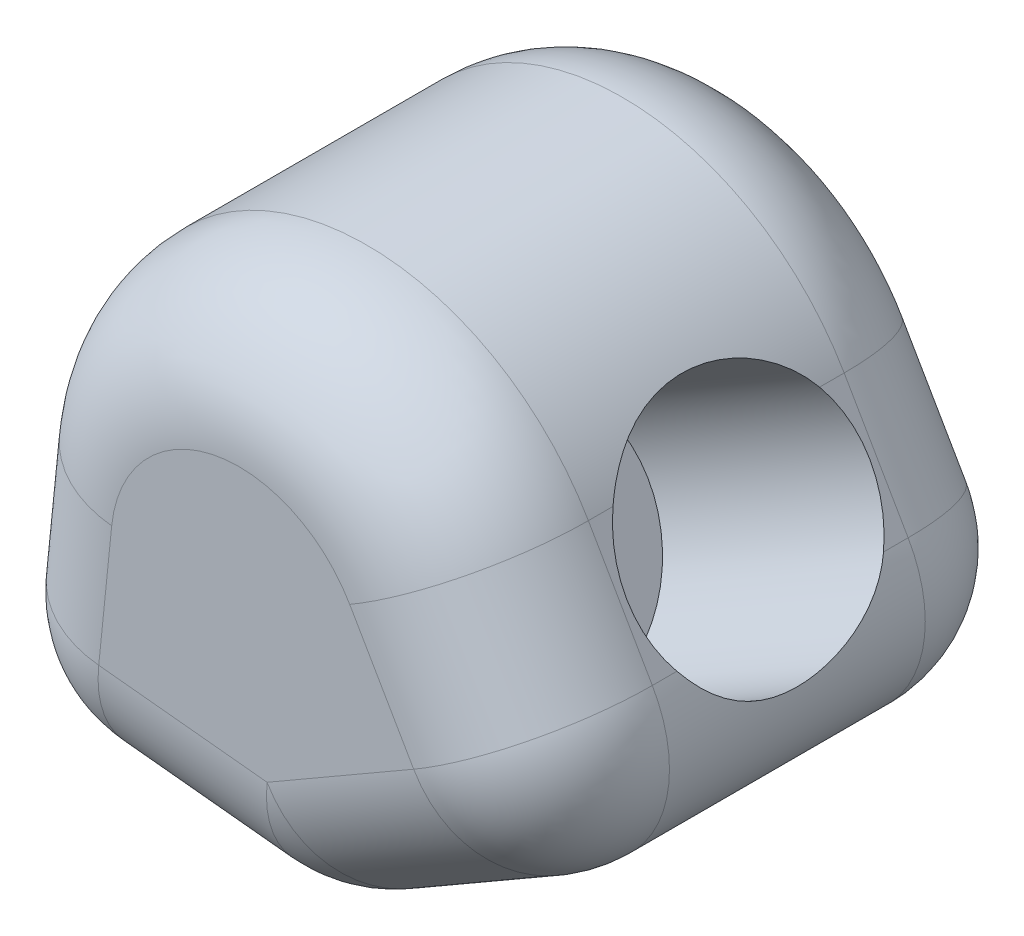
ISO-10303-21;
HEADER;
FILE_DESCRIPTION(('STEP AP214'),'2;1');
FILE_NAME('part.step','',(''),(''),'','','');
FILE_SCHEMA(('AUTOMOTIVE_DESIGN { 1 0 10303 214 1 1 1 1 }'));
ENDSEC;
DATA;
#1=APPLICATION_CONTEXT('core data for automotive mechanical design processes');
#2=APPLICATION_PROTOCOL_DEFINITION('international standard','automotive_design',2000,#1);
#3=PRODUCT_CONTEXT('',#1,'mechanical');
#4=PRODUCT('Part','Part','',(#3));
#5=PRODUCT_RELATED_PRODUCT_CATEGORY('part','',(#4));
#6=PRODUCT_DEFINITION_FORMATION('','',#4);
#7=PRODUCT_DEFINITION_CONTEXT('part definition',#1,'design');
#8=PRODUCT_DEFINITION('design','',#6,#7);
#9=PRODUCT_DEFINITION_SHAPE('','',#8);
#10=(LENGTH_UNIT() NAMED_UNIT(*) SI_UNIT(.MILLI.,.METRE.));
#11=(NAMED_UNIT(*) PLANE_ANGLE_UNIT() SI_UNIT($,.RADIAN.));
#12=(NAMED_UNIT(*) SI_UNIT($,.STERADIAN.) SOLID_ANGLE_UNIT());
#13=UNCERTAINTY_MEASURE_WITH_UNIT(LENGTH_MEASURE(1.E-05),#10,'distance_accuracy_value','');
#14=(GEOMETRIC_REPRESENTATION_CONTEXT(3) GLOBAL_UNCERTAINTY_ASSIGNED_CONTEXT((#13)) GLOBAL_UNIT_ASSIGNED_CONTEXT((#10,
#11,#12)) REPRESENTATION_CONTEXT('',''));
#15=CARTESIAN_POINT('',(0.,0.,0.));
#16=DIRECTION('',(0.,0.,1.));
#17=DIRECTION('',(1.,0.,0.));
#18=AXIS2_PLACEMENT_3D('',#15,#16,#17);
#19=CARTESIAN_POINT('',(147.13325853426,-45.7921285376472,0.));
#20=DIRECTION('',(-0.99484975116711,0.101360606759925,0.));
#21=DIRECTION('',(-0.101360606759925,-0.99484975116711,0.));
#22=AXIS2_PLACEMENT_3D('',#19,#20,#21);
#23=PLANE('',#22);
#24=CARTESIAN_POINT('',(147.18393883764,-45.2947036620637,0.));
#25=DIRECTION('',(-0.99484975116711,0.101360606759925,0.));
#26=DIRECTION('',(-0.101360606759925,-0.99484975116711,0.));
#27=AXIS2_PLACEMENT_3D('',#24,#25,#26);
#28=CIRCLE('',#27,0.950000000000001);
#29=CARTESIAN_POINT('',(147.13325853426,-45.7921285376472,0.807774721070219));
#30=VERTEX_POINT('',#29);
#31=CARTESIAN_POINT('',(147.23461914102,-44.7972787864801,0.807774721070197));
#32=VERTEX_POINT('',#31);
#33=EDGE_CURVE('E54',#30,#32,#28,.T.);
#34=ORIENTED_EDGE('',*,*,#33,.F.);
#35=DIRECTION('',(0.,0.,1.));
#36=VECTOR('',#35,1.);
#37=CARTESIAN_POINT('',(147.13325853426,-45.7921285376472,2.));
#38=LINE('',#37,#36);
#39=CARTESIAN_POINT('',(147.13325853426,-45.7921285376472,1.));
#40=VERTEX_POINT('',#39);
#41=EDGE_CURVE('E393',#30,#40,#38,.T.);
#42=ORIENTED_EDGE('',*,*,#41,.T.);
#43=DIRECTION('',(0.101360606759925,0.99484975116711,0.));
#44=VECTOR('',#43,1.);
#45=CARTESIAN_POINT('',(147.23461914102,-44.7972787864802,1.));
#46=LINE('',#45,#44);
#47=CARTESIAN_POINT('',(147.23461914102,-44.7972787864801,1.));
#48=VERTEX_POINT('',#47);
#49=EDGE_CURVE('E395',#40,#48,#46,.T.);
#50=ORIENTED_EDGE('',*,*,#49,.T.);
#51=DIRECTION('',(0.,0.,1.));
#52=VECTOR('',#51,1.);
#53=CARTESIAN_POINT('',(147.23461914102,-44.7972787864801,-2.));
#54=LINE('',#53,#52);
#55=EDGE_CURVE('E274',#32,#48,#54,.T.);
#56=ORIENTED_EDGE('',*,*,#55,.F.);
#57=EDGE_LOOP('',(#34,#42,#50,#56));
#58=FACE_BOUND('',#57,.T.);
#59=ADVANCED_FACE('F39',(#58),#23,.T.);
#60=CARTESIAN_POINT('',(149.474318643355,-45.4330127018922,0.));
#61=DIRECTION('',(0.866025403784432,0.500000000000011,0.));
#62=DIRECTION('',(-0.500000000000011,0.866025403784432,0.));
#63=AXIS2_PLACEMENT_3D('',#60,#61,#62);
#64=PLANE('',#63);
#65=CARTESIAN_POINT('',(149.474318643355,-45.4330127018922,0.));
#66=DIRECTION('',(0.866025403784432,0.500000000000011,0.));
#67=DIRECTION('',(-0.500000000000011,0.866025403784432,0.));
#68=AXIS2_PLACEMENT_3D('',#65,#66,#67);
#69=CIRCLE('',#68,0.950000000000004);
#70=CARTESIAN_POINT('',(149.224318643355,-45.,0.807774721070159));
#71=VERTEX_POINT('',#70);
#72=CARTESIAN_POINT('',(149.224318643355,-45.,-0.807774721070174));
#73=VERTEX_POINT('',#72);
#74=EDGE_CURVE('E172',#71,#73,#69,.T.);
#75=ORIENTED_EDGE('',*,*,#74,.T.);
#76=DIRECTION('',(0.,0.,1.));
#77=VECTOR('',#76,1.);
#78=CARTESIAN_POINT('',(149.224318643355,-45.,0.));
#79=LINE('',#78,#77);
#80=EDGE_CURVE('E11',#73,#71,#79,.T.);
#81=ORIENTED_EDGE('',*,*,#80,.T.);
#82=EDGE_LOOP('',(#75,#81));
#83=FACE_BOUND('',#82,.T.);
#84=ADVANCED_FACE('F175',(#83),#64,.T.);
#85=CARTESIAN_POINT('',(151.456369450923,-44.8660254037844,1.));
#86=DIRECTION('',(0.866025403784432,0.500000000000011,0.));
#87=DIRECTION('',(-0.500000000000011,0.866025403784433,0.));
#88=AXIS2_PLACEMENT_3D('',#85,#86,#87);
#89=PLANE('',#88);
#90=CARTESIAN_POINT('',(151.206369450923,-44.4330127018922,0.));
#91=DIRECTION('',(0.866025403784432,0.500000000000011,0.));
#92=DIRECTION('',(-0.500000000000011,0.866025403784432,0.));
#93=AXIS2_PLACEMENT_3D('',#90,#91,#92);
#94=CIRCLE('',#93,0.950000000000004);
#95=CARTESIAN_POINT('',(150.956369450923,-43.9999999999999,0.807774721070154));
#96=VERTEX_POINT('',#95);
#97=CARTESIAN_POINT('',(151.456369450923,-44.8660254037844,0.807774721070195));
#98=VERTEX_POINT('',#97);
#99=EDGE_CURVE('E177',#96,#98,#94,.T.);
#100=ORIENTED_EDGE('',*,*,#99,.F.);
#101=DIRECTION('',(0.,0.,1.));
#102=VECTOR('',#101,1.);
#103=CARTESIAN_POINT('',(150.956369450923,-44.,-2.));
#104=LINE('',#103,#102);
#105=CARTESIAN_POINT('',(150.956369450923,-44.,1.));
#106=VERTEX_POINT('',#105);
#107=EDGE_CURVE('E273',#96,#106,#104,.T.);
#108=ORIENTED_EDGE('',*,*,#107,.T.);
#109=DIRECTION('',(-0.500000000000011,0.866025403784433,0.));
#110=VECTOR('',#109,1.);
#111=CARTESIAN_POINT('',(94.1647182049331,54.3660254037849,1.));
#112=LINE('',#111,#110);
#113=CARTESIAN_POINT('',(151.456369450923,-44.8660254037844,1.));
#114=VERTEX_POINT('',#113);
#115=EDGE_CURVE('E389',#106,#114,#112,.F.);
#116=ORIENTED_EDGE('',*,*,#115,.T.);
#117=DIRECTION('',(0.,0.,1.));
#118=VECTOR('',#117,1.);
#119=CARTESIAN_POINT('',(151.456369450923,-44.8660254037844,-2.));
#120=LINE('',#119,#118);
#121=EDGE_CURVE('E386',#114,#98,#120,.F.);
#122=ORIENTED_EDGE('',*,*,#121,.T.);
#123=EDGE_LOOP('',(#100,#108,#116,#122));
#124=FACE_BOUND('',#123,.T.);
#125=ADVANCED_FACE('F251',(#124),#89,.T.);
#126=CARTESIAN_POINT('',(147.23461914102,-44.7972787864802,-0.807774721070197));
#127=VERTEX_POINT('',#126);
#128=CARTESIAN_POINT('',(147.13325853426,-45.7921285376472,-0.807774721070219));
#129=VERTEX_POINT('',#128);
#130=EDGE_CURVE('E263',#127,#129,#28,.T.);
#131=ORIENTED_EDGE('',*,*,#130,.F.);
#132=CARTESIAN_POINT('',(147.23461914102,-44.7972787864801,-1.));
#133=VERTEX_POINT('',#132);
#134=EDGE_CURVE('E221',#133,#127,#54,.T.);
#135=ORIENTED_EDGE('',*,*,#134,.F.);
#136=DIRECTION('',(0.101360606759925,0.99484975116711,0.));
#137=VECTOR('',#136,1.);
#138=CARTESIAN_POINT('',(150.239228428213,-15.3071751133892,-1.));
#139=LINE('',#138,#137);
#140=CARTESIAN_POINT('',(147.13325853426,-45.7921285376472,-1.));
#141=VERTEX_POINT('',#140);
#142=EDGE_CURVE('E391',#133,#141,#139,.F.);
#143=ORIENTED_EDGE('',*,*,#142,.T.);
#144=EDGE_CURVE('E267',#141,#129,#38,.T.);
#145=ORIENTED_EDGE('',*,*,#144,.T.);
#146=EDGE_LOOP('',(#131,#135,#143,#145));
#147=FACE_BOUND('',#146,.T.);
#148=ADVANCED_FACE('F41',(#147),#23,.T.);
#149=CARTESIAN_POINT('',(151.456369450923,-44.8660254037844,-0.807774721070195));
#150=VERTEX_POINT('',#149);
#151=CARTESIAN_POINT('',(150.956369450923,-44.,-0.807774721070154));
#152=VERTEX_POINT('',#151);
#153=EDGE_CURVE('E181',#150,#152,#94,.T.);
#154=ORIENTED_EDGE('',*,*,#153,.F.);
#155=CARTESIAN_POINT('',(151.456369450923,-44.8660254037844,-1.));
#156=VERTEX_POINT('',#155);
#157=EDGE_CURVE('E385',#150,#156,#120,.F.);
#158=ORIENTED_EDGE('',*,*,#157,.T.);
#159=DIRECTION('',(-0.500000000000011,0.866025403784433,0.));
#160=VECTOR('',#159,1.);
#161=CARTESIAN_POINT('',(150.956369450923,-44.0000000000001,-1.));
#162=LINE('',#161,#160);
#163=CARTESIAN_POINT('',(150.956369450923,-44.,-1.));
#164=VERTEX_POINT('',#163);
#165=EDGE_CURVE('E383',#156,#164,#162,.T.);
#166=ORIENTED_EDGE('',*,*,#165,.T.);
#167=EDGE_CURVE('E275',#164,#152,#104,.T.);
#168=ORIENTED_EDGE('',*,*,#167,.T.);
#169=EDGE_LOOP('',(#154,#158,#166,#168));
#170=FACE_BOUND('',#169,.T.);
#171=ADVANCED_FACE('F210',(#170),#89,.T.);
#172=CARTESIAN_POINT('',(149.44445378466,-46.0276054552886,1.));
#173=DIRECTION('',(0.,0.,1.));
#174=DIRECTION('',(1.,0.,0.));
#175=AXIS2_PLACEMENT_3D('',#172,#173,#174);
#176=SPHERICAL_SURFACE('',#175,1.);
#177=CARTESIAN_POINT('',(149.44445378466,-46.0276054552886,1.));
#178=DIRECTION('',(0.,0.,1.));
#179=DIRECTION('',(1.,0.,0.));
#180=AXIS2_PLACEMENT_3D('',#177,#178,#179);
#181=CIRCLE('',#180,1.);
#182=CARTESIAN_POINT('',(149.94445378466,-46.893630859073,1.));
#183=VERTEX_POINT('',#182);
#184=CARTESIAN_POINT('',(149.3430931779,-47.0224552064557,1.));
#185=VERTEX_POINT('',#184);
#186=EDGE_CURVE('E307',#183,#185,#181,.F.);
#187=ORIENTED_EDGE('',*,*,#186,.F.);
#188=CARTESIAN_POINT('',(149.44445378466,-46.0276054552886,1.));
#189=DIRECTION('',(-0.86602540378444,-0.499999999999999,0.));
#190=DIRECTION('',(0.499999999999999,-0.866025403784439,0.));
#191=AXIS2_PLACEMENT_3D('',#188,#189,#190);
#192=CIRCLE('',#191,1.);
#193=CARTESIAN_POINT('',(149.44445378466,-46.0276054552886,2.));
#194=VERTEX_POINT('',#193);
#195=EDGE_CURVE('E199',#194,#183,#192,.F.);
#196=ORIENTED_EDGE('',*,*,#195,.F.);
#197=CARTESIAN_POINT('',(149.44445378466,-46.0276054552886,1.));
#198=DIRECTION('',(0.994849751167113,-0.101360606759888,0.));
#199=DIRECTION('',(0.101360606759888,0.994849751167113,0.));
#200=AXIS2_PLACEMENT_3D('',#197,#198,#199);
#201=CIRCLE('',#200,1.);
#202=EDGE_CURVE('E302',#185,#194,#201,.F.);
#203=ORIENTED_EDGE('',*,*,#202,.F.);
#204=EDGE_LOOP('',(#187,#196,#203));
#205=FACE_BOUND('',#204,.T.);
#206=ADVANCED_FACE('F258',(#205),#176,.T.);
#207=CARTESIAN_POINT('',(149.44445378466,-46.0276054552886,-1.));
#208=DIRECTION('',(0.,0.,1.));
#209=DIRECTION('',(1.,0.,0.));
#210=AXIS2_PLACEMENT_3D('',#207,#208,#209);
#211=SPHERICAL_SURFACE('',#210,1.);
#212=CARTESIAN_POINT('',(149.44445378466,-46.0276054552886,-1.));
#213=DIRECTION('',(0.99484975116711,-0.101360606759915,0.));
#214=DIRECTION('',(0.101360606759915,0.994849751167111,0.));
#215=AXIS2_PLACEMENT_3D('',#212,#213,#214);
#216=CIRCLE('',#215,1.);
#217=CARTESIAN_POINT('',(149.44445378466,-46.0276054552886,-2.));
#218=VERTEX_POINT('',#217);
#219=CARTESIAN_POINT('',(149.3430931779,-47.0224552064557,-1.));
#220=VERTEX_POINT('',#219);
#221=EDGE_CURVE('E333',#218,#220,#216,.F.);
#222=ORIENTED_EDGE('',*,*,#221,.F.);
#223=CARTESIAN_POINT('',(149.44445378466,-46.0276054552886,-1.));
#224=DIRECTION('',(-0.866025403784451,-0.499999999999978,0.));
#225=DIRECTION('',(0.499999999999978,-0.866025403784452,0.));
#226=AXIS2_PLACEMENT_3D('',#223,#224,#225);
#227=CIRCLE('',#226,1.);
#228=CARTESIAN_POINT('',(149.94445378466,-46.893630859073,-1.));
#229=VERTEX_POINT('',#228);
#230=EDGE_CURVE('E324',#229,#218,#227,.F.);
#231=ORIENTED_EDGE('',*,*,#230,.F.);
#232=CARTESIAN_POINT('',(149.44445378466,-46.0276054552886,-1.));
#233=DIRECTION('',(0.,0.,-1.));
#234=DIRECTION('',(-1.,0.,0.));
#235=AXIS2_PLACEMENT_3D('',#232,#233,#234);
#236=CIRCLE('',#235,1.);
#237=EDGE_CURVE('E321',#229,#220,#236,.T.);
#238=ORIENTED_EDGE('',*,*,#237,.T.);
#239=EDGE_LOOP('',(#222,#231,#238));
#240=FACE_BOUND('',#239,.T.);
#241=ADVANCED_FACE('F453',(#240),#211,.T.);
#242=CARTESIAN_POINT('',(149.44445378466,-46.0276054552886,-2.));
#243=DIRECTION('',(0.,0.,-1.));
#244=DIRECTION('',(-1.,0.,0.));
#245=AXIS2_PLACEMENT_3D('',#242,#243,#244);
#246=CYLINDRICAL_SURFACE('',#245,1.);
#247=ORIENTED_EDGE('',*,*,#186,.T.);
#248=DIRECTION('',(0.,0.,1.));
#249=VECTOR('',#248,1.);
#250=CARTESIAN_POINT('',(149.3430931779,-47.0224552064557,2.));
#251=LINE('',#250,#249);
#252=EDGE_CURVE('E370',#220,#185,#251,.T.);
#253=ORIENTED_EDGE('',*,*,#252,.F.);
#254=ORIENTED_EDGE('',*,*,#237,.F.);
#255=DIRECTION('',(0.,0.,1.));
#256=VECTOR('',#255,1.);
#257=CARTESIAN_POINT('',(149.94445378466,-46.893630859073,-2.));
#258=LINE('',#257,#256);
#259=EDGE_CURVE('E379',#183,#229,#258,.F.);
#260=ORIENTED_EDGE('',*,*,#259,.F.);
#261=EDGE_LOOP('',(#247,#253,#254,#260));
#262=FACE_BOUND('',#261,.T.);
#263=ADVANCED_FACE('F451',(#262),#246,.T.);
#264=CARTESIAN_POINT('',(-3.10596989395215,-30.4849534242581,1.));
#265=DIRECTION('',(0.99484975116711,-0.101360606759924,0.));
#266=DIRECTION('',(0.101360606759924,0.99484975116711,0.));
#267=AXIS2_PLACEMENT_3D('',#264,#265,#266);
#268=CYLINDRICAL_SURFACE('',#267,1.);
#269=ORIENTED_EDGE('',*,*,#202,.T.);
#270=DIRECTION('',(0.99484975116711,-0.101360606759924,0.));
#271=VECTOR('',#270,1.);
#272=CARTESIAN_POINT('',(-3.10596989395215,-30.4849534242581,2.));
#273=LINE('',#272,#271);
#274=CARTESIAN_POINT('',(148.128108285428,-45.8934891444071,2.));
#275=VERTEX_POINT('',#274);
#276=EDGE_CURVE('E357',#275,#194,#273,.T.);
#277=ORIENTED_EDGE('',*,*,#276,.F.);
#278=CARTESIAN_POINT('',(148.128108285428,-45.8934891444071,1.));
#279=DIRECTION('',(-0.99484975116711,0.101360606759915,0.));
#280=DIRECTION('',(-0.101360606759915,-0.994849751167111,0.));
#281=AXIS2_PLACEMENT_3D('',#278,#279,#280);
#282=CIRCLE('',#281,1.);
#283=CARTESIAN_POINT('',(148.026747678668,-46.8883388955742,1.));
#284=VERTEX_POINT('',#283);
#285=EDGE_CURVE('E318',#284,#275,#282,.T.);
#286=ORIENTED_EDGE('',*,*,#285,.F.);
#287=DIRECTION('',(0.99484975116711,-0.101360606759924,0.));
#288=VECTOR('',#287,1.);
#289=CARTESIAN_POINT('',(-3.20733050071208,-31.4798031754252,1.));
#290=LINE('',#289,#288);
#291=EDGE_CURVE('E372',#185,#284,#290,.F.);
#292=ORIENTED_EDGE('',*,*,#291,.F.);
#293=EDGE_LOOP('',(#269,#277,#286,#292));
#294=FACE_BOUND('',#293,.T.);
#295=ADVANCED_FACE('F460',(#294),#268,.T.);
#296=CARTESIAN_POINT('',(57.2916512459867,-99.2320508075684,1.));
#297=DIRECTION('',(0.866025403784444,0.49999999999999,0.));
#298=DIRECTION('',(-0.49999999999999,0.866025403784445,0.));
#299=AXIS2_PLACEMENT_3D('',#296,#297,#298);
#300=CYLINDRICAL_SURFACE('',#299,1.);
#301=ORIENTED_EDGE('',*,*,#195,.T.);
#302=DIRECTION('',(-0.866025403784444,-0.49999999999999,0.));
#303=VECTOR('',#302,1.);
#304=CARTESIAN_POINT('',(149.664588925965,-47.0552109105772,1.));
#305=LINE('',#304,#303);
#306=CARTESIAN_POINT('',(151.090344047139,-46.2320508075688,1.));
#307=VERTEX_POINT('',#306);
#308=EDGE_CURVE('E381',#307,#183,#305,.T.);
#309=ORIENTED_EDGE('',*,*,#308,.F.);
#310=CARTESIAN_POINT('',(150.590344047139,-45.3660254037844,1.));
#311=DIRECTION('',(0.866025403784422,0.500000000000028,0.));
#312=DIRECTION('',(-0.500000000000028,0.866025403784422,0.));
#313=AXIS2_PLACEMENT_3D('',#310,#311,#312);
#314=CIRCLE('',#313,1.);
#315=CARTESIAN_POINT('',(150.590344047139,-45.3660254037844,2.));
#316=VERTEX_POINT('',#315);
#317=EDGE_CURVE('E310',#316,#307,#314,.T.);
#318=ORIENTED_EDGE('',*,*,#317,.F.);
#319=DIRECTION('',(-0.866025403784444,-0.49999999999999,0.));
#320=VECTOR('',#319,1.);
#321=CARTESIAN_POINT('',(151.456369450923,-44.8660254037844,2.));
#322=LINE('',#321,#320);
#323=EDGE_CURVE('E179',#194,#316,#322,.F.);
#324=ORIENTED_EDGE('',*,*,#323,.F.);
#325=EDGE_LOOP('',(#301,#309,#318,#324));
#326=FACE_BOUND('',#325,.T.);
#327=ADVANCED_FACE('F467',(#326),#300,.T.);
#328=CARTESIAN_POINT('',(57.2916512459867,-99.2320508075684,-1.));
#329=DIRECTION('',(-0.866025403784444,-0.49999999999999,0.));
#330=DIRECTION('',(0.49999999999999,-0.866025403784445,0.));
#331=AXIS2_PLACEMENT_3D('',#328,#329,#330);
#332=CYLINDRICAL_SURFACE('',#331,1.);
#333=ORIENTED_EDGE('',*,*,#230,.T.);
#334=DIRECTION('',(-0.866025403784444,-0.49999999999999,0.));
#335=VECTOR('',#334,1.);
#336=CARTESIAN_POINT('',(57.2916512459867,-99.2320508075685,-2.));
#337=LINE('',#336,#335);
#338=CARTESIAN_POINT('',(150.590344047139,-45.3660254037844,-2.));
#339=VERTEX_POINT('',#338);
#340=EDGE_CURVE('E404',#339,#218,#337,.T.);
#341=ORIENTED_EDGE('',*,*,#340,.F.);
#342=CARTESIAN_POINT('',(150.590344047139,-45.3660254037844,-1.));
#343=DIRECTION('',(0.86602540378444,0.499999999999999,0.));
#344=DIRECTION('',(-0.499999999999999,0.866025403784439,0.));
#345=AXIS2_PLACEMENT_3D('',#342,#343,#344);
#346=CIRCLE('',#345,1.);
#347=CARTESIAN_POINT('',(151.090344047139,-46.2320508075688,-1.));
#348=VERTEX_POINT('',#347);
#349=EDGE_CURVE('E335',#348,#339,#346,.T.);
#350=ORIENTED_EDGE('',*,*,#349,.F.);
#351=DIRECTION('',(-0.866025403784444,-0.49999999999999,0.));
#352=VECTOR('',#351,1.);
#353=CARTESIAN_POINT('',(57.7916512459867,-100.098076211353,-1.));
#354=LINE('',#353,#352);
#355=EDGE_CURVE('E374',#229,#348,#354,.F.);
#356=ORIENTED_EDGE('',*,*,#355,.F.);
#357=EDGE_LOOP('',(#333,#341,#350,#356));
#358=FACE_BOUND('',#357,.T.);
#359=ADVANCED_FACE('F429',(#358),#332,.T.);
#360=CARTESIAN_POINT('',(-3.10596989395215,-30.4849534242581,-1.));
#361=DIRECTION('',(-0.99484975116711,0.101360606759924,0.));
#362=DIRECTION('',(-0.101360606759924,-0.99484975116711,0.));
#363=AXIS2_PLACEMENT_3D('',#360,#361,#362);
#364=CYLINDRICAL_SURFACE('',#363,1.);
#365=ORIENTED_EDGE('',*,*,#221,.T.);
#366=DIRECTION('',(0.99484975116711,-0.101360606759924,0.));
#367=VECTOR('',#366,1.);
#368=CARTESIAN_POINT('',(149.664588925965,-47.0552109105772,-1.));
#369=LINE('',#368,#367);
#370=CARTESIAN_POINT('',(148.026747678668,-46.8883388955742,-1.));
#371=VERTEX_POINT('',#370);
#372=EDGE_CURVE('E365',#371,#220,#369,.T.);
#373=ORIENTED_EDGE('',*,*,#372,.F.);
#374=CARTESIAN_POINT('',(148.128108285428,-45.8934891444071,-1.));
#375=DIRECTION('',(-0.994849751167108,0.101360606759943,0.));
#376=DIRECTION('',(-0.101360606759943,-0.994849751167108,0.));
#377=AXIS2_PLACEMENT_3D('',#374,#375,#376);
#378=CIRCLE('',#377,1.);
#379=CARTESIAN_POINT('',(148.128108285428,-45.8934891444071,-2.));
#380=VERTEX_POINT('',#379);
#381=EDGE_CURVE('E343',#380,#371,#378,.T.);
#382=ORIENTED_EDGE('',*,*,#381,.F.);
#383=DIRECTION('',(0.99484975116711,-0.101360606759924,0.));
#384=VECTOR('',#383,1.);
#385=CARTESIAN_POINT('',(147.13325853426,-45.7921285376472,-2.));
#386=LINE('',#385,#384);
#387=EDGE_CURVE('E283',#218,#380,#386,.F.);
#388=ORIENTED_EDGE('',*,*,#387,.F.);
#389=EDGE_LOOP('',(#365,#373,#382,#388));
#390=FACE_BOUND('',#389,.T.);
#391=ADVANCED_FACE('F415',(#390),#364,.T.);
#392=CARTESIAN_POINT('',(0.,0.,2.));
#393=DIRECTION('',(0.,0.,1.));
#394=DIRECTION('',(1.,0.,0.));
#395=AXIS2_PLACEMENT_3D('',#392,#393,#394);
#396=PLANE('',#395);
#397=ORIENTED_EDGE('',*,*,#276,.T.);
#398=ORIENTED_EDGE('',*,*,#323,.T.);
#399=DIRECTION('',(-0.500000000000011,0.866025403784433,0.));
#400=VECTOR('',#399,1.);
#401=CARTESIAN_POINT('',(93.2986928011486,53.8660254037849,2.));
#402=LINE('',#401,#400);
#403=CARTESIAN_POINT('',(150.090344047139,-44.5,2.));
#404=VERTEX_POINT('',#403);
#405=EDGE_CURVE('E363',#316,#404,#402,.T.);
#406=ORIENTED_EDGE('',*,*,#405,.T.);
#407=CARTESIAN_POINT('',(149.224318643355,-45.,2.));
#408=DIRECTION('',(0.,0.,1.));
#409=DIRECTION('',(1.,0.,0.));
#410=AXIS2_PLACEMENT_3D('',#407,#408,#409);
#411=CIRCLE('',#410,0.999999999999994);
#412=CARTESIAN_POINT('',(148.229468892187,-44.8986393932401,2.));
#413=VERTEX_POINT('',#412);
#414=EDGE_CURVE('E361',#404,#413,#411,.T.);
#415=ORIENTED_EDGE('',*,*,#414,.T.);
#416=DIRECTION('',(0.101360606759925,0.99484975116711,0.));
#417=VECTOR('',#416,1.);
#418=CARTESIAN_POINT('',(148.026747678668,-46.8883388955742,2.));
#419=LINE('',#418,#417);
#420=EDGE_CURVE('E359',#413,#275,#419,.F.);
#421=ORIENTED_EDGE('',*,*,#420,.T.);
#422=EDGE_LOOP('',(#397,#398,#406,#415,#421));
#423=FACE_BOUND('',#422,.T.);
#424=ADVANCED_FACE('F472',(#423),#396,.T.);
#425=CARTESIAN_POINT('',(148.128108285428,-45.8934891444071,1.));
#426=DIRECTION('',(0.,0.,1.));
#427=DIRECTION('',(1.,0.,0.));
#428=AXIS2_PLACEMENT_3D('',#425,#426,#427);
#429=SPHERICAL_SURFACE('',#428,1.);
#430=ORIENTED_EDGE('',*,*,#285,.T.);
#431=CARTESIAN_POINT('',(148.128108285428,-45.8934891444071,1.));
#432=DIRECTION('',(-0.101360606759928,-0.994849751167109,0.));
#433=DIRECTION('',(0.994849751167109,-0.101360606759928,0.));
#434=AXIS2_PLACEMENT_3D('',#431,#432,#433);
#435=CIRCLE('',#434,1.);
#436=EDGE_CURVE('E315',#275,#40,#435,.T.);
#437=ORIENTED_EDGE('',*,*,#436,.T.);
#438=CARTESIAN_POINT('',(148.128108285428,-45.8934891444071,1.));
#439=DIRECTION('',(0.,0.,1.));
#440=DIRECTION('',(1.,0.,0.));
#441=AXIS2_PLACEMENT_3D('',#438,#439,#440);
#442=CIRCLE('',#441,1.);
#443=EDGE_CURVE('E330',#284,#40,#442,.F.);
#444=ORIENTED_EDGE('',*,*,#443,.F.);
#445=EDGE_LOOP('',(#430,#437,#444));
#446=FACE_BOUND('',#445,.T.);
#447=ADVANCED_FACE('F464',(#446),#429,.T.);
#448=CARTESIAN_POINT('',(-3.20733050071208,-31.4798031754252,-2.));
#449=DIRECTION('',(-0.101360606759924,-0.994849751167109,0.));
#450=DIRECTION('',(0.99484975116711,-0.101360606759924,0.));
#451=AXIS2_PLACEMENT_3D('',#448,#449,#450);
#452=PLANE('',#451);
#453=DIRECTION('',(0.,0.,1.));
#454=VECTOR('',#453,1.);
#455=CARTESIAN_POINT('',(148.026747678668,-46.8883388955742,-2.));
#456=LINE('',#455,#454);
#457=EDGE_CURVE('E368',#284,#371,#456,.F.);
#458=ORIENTED_EDGE('',*,*,#457,.T.);
#459=ORIENTED_EDGE('',*,*,#372,.T.);
#460=ORIENTED_EDGE('',*,*,#252,.T.);
#461=ORIENTED_EDGE('',*,*,#291,.T.);
#462=EDGE_LOOP('',(#458,#459,#460,#461));
#463=FACE_BOUND('',#462,.T.);
#464=ADVANCED_FACE('F231',(#463),#452,.T.);
#465=CARTESIAN_POINT('',(0.,0.,-2.));
#466=DIRECTION('',(0.,0.,1.));
#467=DIRECTION('',(1.,0.,0.));
#468=AXIS2_PLACEMENT_3D('',#465,#466,#467);
#469=PLANE('',#468);
#470=DIRECTION('',(0.101360606759925,0.99484975116711,0.));
#471=VECTOR('',#470,1.);
#472=CARTESIAN_POINT('',(151.23407817938,-15.4085357201491,-2.));
#473=LINE('',#472,#471);
#474=CARTESIAN_POINT('',(148.229468892187,-44.8986393932401,-2.));
#475=VERTEX_POINT('',#474);
#476=EDGE_CURVE('E400',#380,#475,#473,.T.);
#477=ORIENTED_EDGE('',*,*,#476,.T.);
#478=CARTESIAN_POINT('',(149.224318643355,-45.,-2.));
#479=DIRECTION('',(0.,0.,1.));
#480=DIRECTION('',(1.,0.,0.));
#481=AXIS2_PLACEMENT_3D('',#478,#479,#480);
#482=CIRCLE('',#481,0.999999999999994);
#483=CARTESIAN_POINT('',(150.090344047139,-44.5,-2.));
#484=VERTEX_POINT('',#483);
#485=EDGE_CURVE('E397',#475,#484,#482,.F.);
#486=ORIENTED_EDGE('',*,*,#485,.T.);
#487=DIRECTION('',(-0.500000000000011,0.866025403784433,0.));
#488=VECTOR('',#487,1.);
#489=CARTESIAN_POINT('',(151.090344047139,-46.2320508075689,-2.));
#490=LINE('',#489,#488);
#491=EDGE_CURVE('E402',#484,#339,#490,.F.);
#492=ORIENTED_EDGE('',*,*,#491,.T.);
#493=ORIENTED_EDGE('',*,*,#340,.T.);
#494=ORIENTED_EDGE('',*,*,#387,.T.);
#495=EDGE_LOOP('',(#477,#486,#492,#493,#494));
#496=FACE_BOUND('',#495,.T.);
#497=ADVANCED_FACE('F408',(#496),#469,.F.);
#498=CARTESIAN_POINT('',(149.224318643355,-45.,-1.));
#499=DIRECTION('',(0.,0.,1.));
#500=DIRECTION('',(1.,0.,0.));
#501=AXIS2_PLACEMENT_3D('',#498,#499,#500);
#502=DEGENERATE_TOROIDAL_SURFACE('',#501,0.999999999999994,1.,.T.);
#503=CARTESIAN_POINT('',(150.090344047139,-44.5,-1.));
#504=DIRECTION('',(-0.500000000000004,0.866025403784437,0.));
#505=DIRECTION('',(-0.866025403784436,-0.500000000000004,0.));
#506=AXIS2_PLACEMENT_3D('',#503,#504,#505);
#507=CIRCLE('',#506,1.);
#508=EDGE_CURVE('E352',#164,#484,#507,.T.);
#509=ORIENTED_EDGE('',*,*,#508,.T.);
#510=ORIENTED_EDGE('',*,*,#485,.F.);
#511=CARTESIAN_POINT('',(148.229468892187,-44.8986393932401,-1.));
#512=DIRECTION('',(0.101360606759925,0.99484975116711,0.));
#513=DIRECTION('',(-0.99484975116711,0.101360606759925,0.));
#514=AXIS2_PLACEMENT_3D('',#511,#512,#513);
#515=CIRCLE('',#514,1.);
#516=EDGE_CURVE('E220',#475,#133,#515,.T.);
#517=ORIENTED_EDGE('',*,*,#516,.T.);
#518=CARTESIAN_POINT('',(149.224318643355,-45.,-1.));
#519=DIRECTION('',(0.,0.,1.));
#520=DIRECTION('',(1.,0.,0.));
#521=AXIS2_PLACEMENT_3D('',#518,#519,#520);
#522=CIRCLE('',#521,1.99999999999999);
#523=EDGE_CURVE('E272',#164,#133,#522,.T.);
#524=ORIENTED_EDGE('',*,*,#523,.F.);
#525=EDGE_LOOP('',(#509,#510,#517,#524));
#526=FACE_BOUND('',#525,.T.);
#527=ADVANCED_FACE('F229',(#526),#502,.T.);
#528=CARTESIAN_POINT('',(148.128108285428,-45.8934891444071,-1.));
#529=DIRECTION('',(0.,0.,1.));
#530=DIRECTION('',(1.,0.,0.));
#531=AXIS2_PLACEMENT_3D('',#528,#529,#530);
#532=SPHERICAL_SURFACE('',#531,1.);
#533=ORIENTED_EDGE('',*,*,#381,.T.);
#534=CARTESIAN_POINT('',(148.128108285428,-45.8934891444071,-1.));
#535=DIRECTION('',(0.,0.,-1.));
#536=DIRECTION('',(-1.,0.,0.));
#537=AXIS2_PLACEMENT_3D('',#534,#535,#536);
#538=CIRCLE('',#537,1.);
#539=EDGE_CURVE('E340',#371,#141,#538,.T.);
#540=ORIENTED_EDGE('',*,*,#539,.T.);
#541=CARTESIAN_POINT('',(148.128108285428,-45.8934891444071,-1.));
#542=DIRECTION('',(-0.101360606759921,-0.99484975116711,0.));
#543=DIRECTION('',(0.99484975116711,-0.101360606759921,0.));
#544=AXIS2_PLACEMENT_3D('',#541,#542,#543);
#545=CIRCLE('',#544,1.);
#546=EDGE_CURVE('E349',#380,#141,#545,.F.);
#547=ORIENTED_EDGE('',*,*,#546,.F.);
#548=EDGE_LOOP('',(#533,#540,#547));
#549=FACE_BOUND('',#548,.T.);
#550=ADVANCED_FACE('F418',(#549),#532,.T.);
#551=CARTESIAN_POINT('',(151.23407817938,-15.4085357201491,-1.));
#552=DIRECTION('',(0.101360606759925,0.99484975116711,0.));
#553=DIRECTION('',(-0.99484975116711,0.101360606759925,0.));
#554=AXIS2_PLACEMENT_3D('',#551,#552,#553);
#555=CYLINDRICAL_SURFACE('',#554,1.);
#556=ORIENTED_EDGE('',*,*,#546,.T.);
#557=ORIENTED_EDGE('',*,*,#142,.F.);
#558=ORIENTED_EDGE('',*,*,#516,.F.);
#559=ORIENTED_EDGE('',*,*,#476,.F.);
#560=EDGE_LOOP('',(#556,#557,#558,#559));
#561=FACE_BOUND('',#560,.T.);
#562=ADVANCED_FACE('F422',(#561),#555,.T.);
#563=CARTESIAN_POINT('',(150.590344047139,-45.3660254037844,-1.));
#564=DIRECTION('',(0.,0.,1.));
#565=DIRECTION('',(1.,0.,0.));
#566=AXIS2_PLACEMENT_3D('',#563,#564,#565);
#567=SPHERICAL_SURFACE('',#566,1.);
#568=CARTESIAN_POINT('',(150.590344047139,-45.3660254037844,-1.));
#569=DIRECTION('',(0.,0.,-1.));
#570=DIRECTION('',(-1.,0.,0.));
#571=AXIS2_PLACEMENT_3D('',#568,#569,#570);
#572=CIRCLE('',#571,1.);
#573=EDGE_CURVE('E338',#156,#348,#572,.T.);
#574=ORIENTED_EDGE('',*,*,#573,.T.);
#575=ORIENTED_EDGE('',*,*,#349,.T.);
#576=CARTESIAN_POINT('',(150.590344047139,-45.3660254037844,-1.));
#577=DIRECTION('',(0.500000000000021,-0.866025403784426,0.));
#578=DIRECTION('',(0.866025403784427,0.500000000000021,0.));
#579=AXIS2_PLACEMENT_3D('',#576,#577,#578);
#580=CIRCLE('',#579,1.);
#581=EDGE_CURVE('E346',#156,#339,#580,.F.);
#582=ORIENTED_EDGE('',*,*,#581,.F.);
#583=EDGE_LOOP('',(#574,#575,#582));
#584=FACE_BOUND('',#583,.T.);
#585=ADVANCED_FACE('F436',(#584),#567,.T.);
#586=CARTESIAN_POINT('',(93.2986928011486,53.8660254037849,-1.));
#587=DIRECTION('',(0.500000000000011,-0.866025403784433,0.));
#588=DIRECTION('',(0.866025403784432,0.500000000000011,0.));
#589=AXIS2_PLACEMENT_3D('',#586,#587,#588);
#590=CYLINDRICAL_SURFACE('',#589,1.);
#591=ORIENTED_EDGE('',*,*,#581,.T.);
#592=ORIENTED_EDGE('',*,*,#491,.F.);
#593=ORIENTED_EDGE('',*,*,#508,.F.);
#594=ORIENTED_EDGE('',*,*,#165,.F.);
#595=EDGE_LOOP('',(#591,#592,#593,#594));
#596=FACE_BOUND('',#595,.T.);
#597=ADVANCED_FACE('F439',(#596),#590,.T.);
#598=CARTESIAN_POINT('',(148.128108285428,-45.8934891444071,-2.));
#599=DIRECTION('',(0.,0.,-1.));
#600=DIRECTION('',(-1.,0.,0.));
#601=AXIS2_PLACEMENT_3D('',#598,#599,#600);
#602=CYLINDRICAL_SURFACE('',#601,1.);
#603=CARTESIAN_POINT('',(147.13325853426,-45.7921285376472,-0.807774721070217));
#604=CARTESIAN_POINT('',(147.128808286797,-45.8356683679362,-0.780728478925981));
#605=CARTESIAN_POINT('',(147.127483934738,-45.8771040972475,-0.750174645235957));
#606=CARTESIAN_POINT('',(147.12923179671,-45.9545566836069,-0.683242434496667));
#607=CARTESIAN_POINT('',(147.132283042756,-45.9905984762552,-0.646892572675732));
#608=CARTESIAN_POINT('',(147.14090382173,-46.0563666496611,-0.569423565132301));
#609=CARTESIAN_POINT('',(147.146464051692,-46.0861157695901,-0.528322451440242));
#610=CARTESIAN_POINT('',(147.158303414866,-46.1388652578622,-0.441999279103337));
#611=CARTESIAN_POINT('',(147.164583668767,-46.1618549015871,-0.396770819363252));
#612=CARTESIAN_POINT('',(147.176574875258,-46.2017997675019,-0.299529700347529));
#613=CARTESIAN_POINT('',(147.182206958969,-46.2181677954283,-0.247262650299686));
#614=CARTESIAN_POINT('',(147.190487946811,-46.2413773059551,-0.14046627191814));
#615=CARTESIAN_POINT('',(147.193141467247,-46.2482335342561,-0.0859405805177638));
#616=CARTESIAN_POINT('',(147.194522496841,-46.2518447407895,0.0189798108930409));
#617=CARTESIAN_POINT('',(147.193555679191,-46.2493859898068,0.0693444283581493));
#618=CARTESIAN_POINT('',(147.188661173876,-46.2362517698503,0.168843990087968));
#619=CARTESIAN_POINT('',(147.184732372532,-46.2255732102698,0.217978464648642));
#620=CARTESIAN_POINT('',(147.175162011363,-46.1969856022973,0.312239121906973));
#621=CARTESIAN_POINT('',(147.169576103992,-46.1793060427462,0.35744172434152));
#622=CARTESIAN_POINT('',(147.158044154733,-46.1373101048263,0.444655311826876));
#623=CARTESIAN_POINT('',(147.152097675053,-46.112985527528,0.486662271543371));
#624=CARTESIAN_POINT('',(147.140791336892,-46.0552469802789,0.571172693899379));
#625=CARTESIAN_POINT('',(147.135570292786,-46.0211229551947,0.613211695602867));
#626=CARTESIAN_POINT('',(147.128806463323,-45.9463386263305,0.691242959019938));
#627=CARTESIAN_POINT('',(147.12725164492,-45.9057001741674,0.727254640609795));
#628=CARTESIAN_POINT('',(147.128940775076,-45.8511189025003,0.768169373606517));
#629=CARTESIAN_POINT('',(147.129494866583,-45.8395444699301,0.776459217278774));
#630=CARTESIAN_POINT('',(147.131040287224,-45.8160729320834,0.792513471202036));
#631=CARTESIAN_POINT('',(147.132031420711,-45.8041759734237,0.800278114773276));
#632=CARTESIAN_POINT('',(147.13325853426,-45.7921285376472,0.807774721070231));
#633=B_SPLINE_CURVE_WITH_KNOTS('',3,(#603,#604,#605,#606,#607,#608,#609,#610,#611,#612,#613,
#614,#615,#616,#617,#618,#619,#620,#621,#622,#623,#624,#625,#626,#627,#628,#629,#630,#631,#632),
.UNSPECIFIED.,.F.,.F.,(4,2,2,2,2,2,2,2,2,2,2,2,2,2,4),(0.,0.1538074567111,0.306880322196099,
0.459390219878526,0.612140800698552,0.77643286659063,0.940469952444962,1.09098160687053,
1.24154988058079,1.38754444671328,1.53371996767869,1.69615413105594,1.85805441705973,
1.90078296757982,1.94349240953927),.UNSPECIFIED.);
#634=EDGE_CURVE('E184',#129,#30,#633,.T.);
#635=ORIENTED_EDGE('',*,*,#634,.F.);
#636=ORIENTED_EDGE('',*,*,#144,.F.);
#637=ORIENTED_EDGE('',*,*,#539,.F.);
#638=ORIENTED_EDGE('',*,*,#457,.F.);
#639=ORIENTED_EDGE('',*,*,#443,.T.);
#640=ORIENTED_EDGE('',*,*,#41,.F.);
#641=EDGE_LOOP('',(#635,#636,#637,#638,#639,#640));
#642=FACE_BOUND('',#641,.T.);
#643=ADVANCED_FACE('F493',(#642),#602,.T.);
#644=CARTESIAN_POINT('',(57.7916512459867,-100.098076211353,-2.));
#645=DIRECTION('',(-0.49999999999999,0.866025403784445,0.));
#646=DIRECTION('',(-0.866025403784444,-0.49999999999999,0.));
#647=AXIS2_PLACEMENT_3D('',#644,#645,#646);
#648=PLANE('',#647);
#649=ORIENTED_EDGE('',*,*,#259,.T.);
#650=ORIENTED_EDGE('',*,*,#355,.T.);
#651=DIRECTION('',(0.,0.,1.));
#652=VECTOR('',#651,1.);
#653=CARTESIAN_POINT('',(151.090344047139,-46.2320508075689,2.));
#654=LINE('',#653,#652);
#655=EDGE_CURVE('E377',#348,#307,#654,.T.);
#656=ORIENTED_EDGE('',*,*,#655,.T.);
#657=ORIENTED_EDGE('',*,*,#308,.T.);
#658=EDGE_LOOP('',(#649,#650,#656,#657));
#659=FACE_BOUND('',#658,.T.);
#660=ADVANCED_FACE('F446',(#659),#648,.F.);
#661=CARTESIAN_POINT('',(150.590344047139,-45.3660254037844,1.));
#662=DIRECTION('',(0.,0.,1.));
#663=DIRECTION('',(1.,0.,0.));
#664=AXIS2_PLACEMENT_3D('',#661,#662,#663);
#665=SPHERICAL_SURFACE('',#664,1.);
#666=CARTESIAN_POINT('',(150.590344047139,-45.3660254037844,1.));
#667=DIRECTION('',(0.500000000000004,-0.866025403784437,0.));
#668=DIRECTION('',(0.866025403784436,0.500000000000004,0.));
#669=AXIS2_PLACEMENT_3D('',#666,#667,#668);
#670=CIRCLE('',#669,1.);
#671=EDGE_CURVE('E313',#114,#316,#670,.T.);
#672=ORIENTED_EDGE('',*,*,#671,.T.);
#673=ORIENTED_EDGE('',*,*,#317,.T.);
#674=CARTESIAN_POINT('',(150.590344047139,-45.3660254037844,1.));
#675=DIRECTION('',(0.,0.,1.));
#676=DIRECTION('',(1.,0.,0.));
#677=AXIS2_PLACEMENT_3D('',#674,#675,#676);
#678=CIRCLE('',#677,1.);
#679=EDGE_CURVE('E327',#114,#307,#678,.F.);
#680=ORIENTED_EDGE('',*,*,#679,.F.);
#681=EDGE_LOOP('',(#672,#673,#680));
#682=FACE_BOUND('',#681,.T.);
#683=ADVANCED_FACE('F486',(#682),#665,.T.);
#684=CARTESIAN_POINT('',(150.590344047139,-45.3660254037844,-2.));
#685=DIRECTION('',(0.,0.,-1.));
#686=DIRECTION('',(-1.,0.,0.));
#687=AXIS2_PLACEMENT_3D('',#684,#685,#686);
#688=CYLINDRICAL_SURFACE('',#687,1.);
#689=CARTESIAN_POINT('',(151.456369450923,-44.8660254037844,0.807774721070217));
#690=CARTESIAN_POINT('',(151.478264999872,-44.9039213990917,0.780728478925978));
#691=CARTESIAN_POINT('',(151.496447032553,-44.9411784421776,0.750174645235955));
#692=CARTESIAN_POINT('',(151.526580541866,-45.0125502137105,0.683242434496667));
#693=CARTESIAN_POINT('',(151.538561361166,-45.0466791001358,0.646892572675732));
#694=CARTESIAN_POINT('',(151.557638633303,-45.1102072683063,0.569423565132298));
#695=CARTESIAN_POINT('',(151.564752887696,-45.1396234828521,0.528322451440237));
#696=CARTESIAN_POINT('',(151.575560994555,-45.1925938883581,0.44199927910333));
#697=CARTESIAN_POINT('',(151.579249431404,-45.2161387549169,0.396770819363245));
#698=CARTESIAN_POINT('',(151.584673682972,-45.2574904035053,0.29952970034752));
#699=CARTESIAN_POINT('',(151.586240904852,-45.2747292120693,0.247262650299677));
#700=CARTESIAN_POINT('',(151.588194248365,-45.2992942398048,0.140466271918134));
#701=CARTESIAN_POINT('',(151.588582199282,-45.3066358017169,0.0859405805177611));
#702=CARTESIAN_POINT('',(151.588801670447,-45.3104958389932,-0.018979810893043));
#703=CARTESIAN_POINT('',(151.588676432836,-45.3078568035054,-0.069344428358154));
#704=CARTESIAN_POINT('',(151.587761068493,-45.2938701661588,-0.168843990087976));
#705=CARTESIAN_POINT('',(151.586970691663,-45.2825192886959,-0.217978464648651));
#706=CARTESIAN_POINT('',(151.583990467683,-45.2525199319107,-0.312239121906982));
#707=CARTESIAN_POINT('',(151.581843860566,-45.2341036004367,-0.357441724341529));
#708=CARTESIAN_POINT('',(151.575160444301,-45.1910690026982,-0.444655311826885));
#709=CARTESIAN_POINT('',(151.570620675885,-45.1664430776587,-0.486662271543382));
#710=CARTESIAN_POINT('',(151.557282581224,-45.109139776254,-0.57117269389939));
#711=CARTESIAN_POINT('',(151.548066752361,-45.0758715197943,-0.613211695602874));
#712=CARTESIAN_POINT('',(151.523602072338,-45.0048790929866,-0.691242959019947));
#713=CARTESIAN_POINT('',(151.508373149653,-44.967169927412,-0.727254640609808));
#714=CARTESIAN_POINT('',(151.484473357057,-44.9180703521458,-0.768169373606528));
#715=CARTESIAN_POINT('',(151.479226492563,-44.9077386088416,-0.776459217278783));
#716=CARTESIAN_POINT('',(151.468201714592,-44.8869598772986,-0.792513471202039));
#717=CARTESIAN_POINT('',(151.462424039653,-44.8765129426647,-0.800278114773276));
#718=CARTESIAN_POINT('',(151.456369450923,-44.8660254037844,-0.807774721070228));
#719=B_SPLINE_CURVE_WITH_KNOTS('',3,(#689,#690,#691,#692,#693,#694,#695,#696,#697,#698,#699,
#700,#701,#702,#703,#704,#705,#706,#707,#708,#709,#710,#711,#712,#713,#714,#715,#716,#717,#718),
.UNSPECIFIED.,.F.,.F.,(4,2,2,2,2,2,2,2,2,2,2,2,2,2,4),(0.,0.15380745671109,0.306880322196098,
0.459390219878525,0.612140800698553,0.776432866590629,0.940469952444954,1.09098160687053,
1.24154988058079,1.38754444671329,1.53371996767869,1.69615413105593,1.85805441705974,
1.90078296757982,1.94349240953926),.UNSPECIFIED.);
#720=EDGE_CURVE('E176',#98,#150,#719,.T.);
#721=ORIENTED_EDGE('',*,*,#720,.F.);
#722=ORIENTED_EDGE('',*,*,#121,.F.);
#723=ORIENTED_EDGE('',*,*,#679,.T.);
#724=ORIENTED_EDGE('',*,*,#655,.F.);
#725=ORIENTED_EDGE('',*,*,#573,.F.);
#726=ORIENTED_EDGE('',*,*,#157,.F.);
#727=EDGE_LOOP('',(#721,#722,#723,#724,#725,#726));
#728=FACE_BOUND('',#727,.T.);
#729=ADVANCED_FACE('F201',(#728),#688,.T.);
#730=CARTESIAN_POINT('',(149.224318643355,-45.,1.));
#731=DIRECTION('',(0.,0.,1.));
#732=DIRECTION('',(1.,0.,0.));
#733=AXIS2_PLACEMENT_3D('',#730,#731,#732);
#734=DEGENERATE_TOROIDAL_SURFACE('',#733,0.999999999999994,1.,.T.);
#735=CARTESIAN_POINT('',(148.229468892187,-44.8986393932401,1.));
#736=DIRECTION('',(-0.101360606759921,-0.99484975116711,0.));
#737=DIRECTION('',(0.99484975116711,-0.101360606759921,0.));
#738=AXIS2_PLACEMENT_3D('',#735,#736,#737);
#739=CIRCLE('',#738,1.);
#740=EDGE_CURVE('E297',#413,#48,#739,.T.);
#741=ORIENTED_EDGE('',*,*,#740,.F.);
#742=ORIENTED_EDGE('',*,*,#414,.F.);
#743=CARTESIAN_POINT('',(150.090344047139,-44.5,1.));
#744=DIRECTION('',(0.499999999999993,-0.866025403784442,0.));
#745=DIRECTION('',(0.866025403784442,0.499999999999993,0.));
#746=AXIS2_PLACEMENT_3D('',#743,#744,#745);
#747=CIRCLE('',#746,1.);
#748=EDGE_CURVE('E290',#106,#404,#747,.T.);
#749=ORIENTED_EDGE('',*,*,#748,.F.);
#750=CARTESIAN_POINT('',(149.224318643355,-45.,1.));
#751=DIRECTION('',(0.,0.,1.));
#752=DIRECTION('',(1.,0.,0.));
#753=AXIS2_PLACEMENT_3D('',#750,#751,#752);
#754=CIRCLE('',#753,1.99999999999999);
#755=EDGE_CURVE('E276',#48,#106,#754,.F.);
#756=ORIENTED_EDGE('',*,*,#755,.F.);
#757=EDGE_LOOP('',(#741,#742,#749,#756));
#758=FACE_BOUND('',#757,.T.);
#759=ADVANCED_FACE('F211',(#758),#734,.T.);
#760=CARTESIAN_POINT('',(151.23407817938,-15.4085357201491,1.));
#761=DIRECTION('',(-0.101360606759925,-0.99484975116711,0.));
#762=DIRECTION('',(0.99484975116711,-0.101360606759925,0.));
#763=AXIS2_PLACEMENT_3D('',#760,#761,#762);
#764=CYLINDRICAL_SURFACE('',#763,1.);
#765=ORIENTED_EDGE('',*,*,#740,.T.);
#766=ORIENTED_EDGE('',*,*,#49,.F.);
#767=ORIENTED_EDGE('',*,*,#436,.F.);
#768=ORIENTED_EDGE('',*,*,#420,.F.);
#769=EDGE_LOOP('',(#765,#766,#767,#768));
#770=FACE_BOUND('',#769,.T.);
#771=ADVANCED_FACE('F483',(#770),#764,.T.);
#772=CARTESIAN_POINT('',(93.2986928011486,53.8660254037849,1.));
#773=DIRECTION('',(-0.500000000000011,0.866025403784433,0.));
#774=DIRECTION('',(-0.866025403784432,-0.500000000000011,0.));
#775=AXIS2_PLACEMENT_3D('',#772,#773,#774);
#776=CYLINDRICAL_SURFACE('',#775,1.);
#777=ORIENTED_EDGE('',*,*,#748,.T.);
#778=ORIENTED_EDGE('',*,*,#405,.F.);
#779=ORIENTED_EDGE('',*,*,#671,.F.);
#780=ORIENTED_EDGE('',*,*,#115,.F.);
#781=EDGE_LOOP('',(#777,#778,#779,#780));
#782=FACE_BOUND('',#781,.T.);
#783=ADVANCED_FACE('F227',(#782),#776,.T.);
#784=CARTESIAN_POINT('',(149.224318643355,-45.,-2.));
#785=DIRECTION('',(0.,0.,1.));
#786=DIRECTION('',(1.,0.,0.));
#787=AXIS2_PLACEMENT_3D('',#784,#785,#786);
#788=CYLINDRICAL_SURFACE('',#787,1.99999999999999);
#789=CARTESIAN_POINT('',(147.23461914102,-44.7972787864801,0.807774721070196));
#790=CARTESIAN_POINT('',(147.239168043864,-44.7524739688476,0.779948488754343));
#791=CARTESIAN_POINT('',(147.245016332862,-44.7102438583342,0.748326299092347));
#792=CARTESIAN_POINT('',(147.258090338206,-44.6318897304369,0.678588962940401));
#793=CARTESIAN_POINT('',(147.265313911609,-44.5957563762649,0.640483927608961));
#794=CARTESIAN_POINT('',(147.279933849662,-44.5304300270251,0.558814385847855));
#795=CARTESIAN_POINT('',(147.287330096882,-44.5012324578997,0.515253506590201));
#796=CARTESIAN_POINT('',(147.301143267131,-44.4503713907921,0.423785527122142));
#797=CARTESIAN_POINT('',(147.307560076257,-44.4287087687092,0.375877922442612));
#798=CARTESIAN_POINT('',(147.318522072673,-44.3931263672019,0.276087632373644));
#799=CARTESIAN_POINT('',(147.323032145444,-44.3793503274541,0.224149622565759));
#800=CARTESIAN_POINT('',(147.329280179527,-44.3605239671927,0.118552498421795));
#801=CARTESIAN_POINT('',(147.331018465545,-44.3554726245971,0.0648935864364572));
#802=CARTESIAN_POINT('',(147.331432916931,-44.3542575088228,-0.0413555183955967));
#803=CARTESIAN_POINT('',(147.330175403792,-44.357901245549,-0.0939433401200948));
#804=CARTESIAN_POINT('',(147.324936741998,-44.3735692863966,-0.197708044348278));
#805=CARTESIAN_POINT('',(147.320955712634,-44.3855932234624,-0.248884988546829));
#806=CARTESIAN_POINT('',(147.310906024026,-44.4176509858712,-0.348265516001486));
#807=CARTESIAN_POINT('',(147.304843914665,-44.4376597120294,-0.396477875106808));
#808=CARTESIAN_POINT('',(147.291551069042,-44.4852009104198,-0.48885518025683));
#809=CARTESIAN_POINT('',(147.284320087463,-44.5127349628775,-0.533019273611717));
#810=CARTESIAN_POINT('',(147.268994214004,-44.5781613553481,-0.620744549836656));
#811=CARTESIAN_POINT('',(147.260891081444,-44.616855703725,-0.663715097259791));
#812=CARTESIAN_POINT('',(147.249888078047,-44.6804844710878,-0.722320527054403));
#813=CARTESIAN_POINT('',(147.246407449799,-44.7026675730941,-0.740907078154453));
#814=CARTESIAN_POINT('',(147.24002811765,-44.7487364571607,-0.775964466024796));
#815=CARTESIAN_POINT('',(147.237129620807,-44.7726228409854,-0.792434549237022));
#816=CARTESIAN_POINT('',(147.23461914102,-44.7972787864801,-0.807774721070194));
#817=B_SPLINE_CURVE_WITH_KNOTS('',3,(#789,#790,#791,#792,#793,#794,#795,#796,#797,#798,#799,
#800,#801,#802,#803,#804,#805,#806,#807,#808,#809,#810,#811,#812,#813,#814,#815,#816),
.UNSPECIFIED.,.F.,.F.,(4,2,2,2,2,2,2,2,2,2,2,2,2,4),(0.,0.158508219565231,0.316771446353006,
0.474930009079822,0.633106950795595,0.794081852510599,0.955037895036707,1.11246389268906,
1.2698829954617,1.4268111202715,1.58377222340147,1.75784522568172,1.84517785258571,
1.93254148819681),.UNSPECIFIED.);
#818=EDGE_CURVE('E173',#32,#127,#817,.T.);
#819=ORIENTED_EDGE('',*,*,#818,.F.);
#820=ORIENTED_EDGE('',*,*,#55,.T.);
#821=ORIENTED_EDGE('',*,*,#755,.T.);
#822=ORIENTED_EDGE('',*,*,#107,.F.);
#823=CARTESIAN_POINT('',(150.956369450923,-44.,-0.807774721070186));
#824=CARTESIAN_POINT('',(150.933865709558,-43.9609904393166,-0.779948488754334));
#825=CARTESIAN_POINT('',(150.911231322433,-43.924861929277,-0.748326299092333));
#826=CARTESIAN_POINT('',(150.867207320845,-43.8587394198086,-0.678588962940381));
#827=CARTESIAN_POINT('',(150.845815836512,-43.8287360250927,-0.640483927608937));
#828=CARTESIAN_POINT('',(150.805718316385,-43.7751313296515,-0.55881438584783));
#829=CARTESIAN_POINT('',(150.787010513981,-43.7515258081579,-0.515253506590177));
#830=CARTESIAN_POINT('',(150.753574580375,-43.7107865130788,-0.423785527122118));
#831=CARTESIAN_POINT('',(150.738846911888,-43.6936534918687,-0.375877922442587));
#832=CARTESIAN_POINT('',(150.714270762592,-43.6656841238342,-0.27608763237362));
#833=CARTESIAN_POINT('',(150.704513196943,-43.6549645184248,-0.224149622565736));
#834=CARTESIAN_POINT('',(150.691101350403,-43.6403497265007,-0.118552498421774));
#835=CARTESIAN_POINT('',(150.68744635461,-43.6364537406111,-0.0648935864364362));
#836=CARTESIAN_POINT('',(150.68657050831,-43.6355150342913,0.0413555183956181));
#837=CARTESIAN_POINT('',(150.689210303906,-43.6383238838488,0.0939433401201169));
#838=CARTESIAN_POINT('',(150.700407568511,-43.6504709965407,0.197708044348303));
#839=CARTESIAN_POINT('',(150.708964778336,-43.6598089736971,0.248884988546857));
#840=CARTESIAN_POINT('',(150.731264831662,-43.6849367271467,0.348265516001517));
#841=CARTESIAN_POINT('',(150.744991418332,-43.7007062899423,0.396477875106841));
#842=CARTESIAN_POINT('',(150.776592723809,-43.7386301977227,0.488855180256861));
#843=CARTESIAN_POINT('',(150.794468313735,-43.7607858837679,0.533019273611746));
#844=CARTESIAN_POINT('',(150.835250802342,-43.8141926609783,0.620744549836676));
#845=CARTESIAN_POINT('',(150.858493756473,-43.8461720048877,0.663715097259804));
#846=CARTESIAN_POINT('',(150.894596340121,-43.8997097446028,0.722320527054409));
#847=CARTESIAN_POINT('',(150.906858702416,-43.9185203601846,0.740907078154457));
#848=CARTESIAN_POINT('',(150.931550061857,-43.9579332353243,0.775964466024794));
#849=CARTESIAN_POINT('',(150.943979116622,-43.9785361286597,0.792434549237015));
#850=CARTESIAN_POINT('',(150.956369450923,-44.,0.807774721070185));
#851=B_SPLINE_CURVE_WITH_KNOTS('',3,(#823,#824,#825,#826,#827,#828,#829,#830,#831,#832,#833,
#834,#835,#836,#837,#838,#839,#840,#841,#842,#843,#844,#845,#846,#847,#848,#849,#850),
.UNSPECIFIED.,.F.,.F.,(4,2,2,2,2,2,2,2,2,2,2,2,2,4),(0.,0.158508219565243,0.316771446353017,
0.474930009079838,0.633106950795599,0.794081852510597,0.955037895036707,1.11246389268907,
1.2698829954617,1.42681112027151,1.58377222340148,1.75784522568172,1.8451778525857,
1.93254148819677),.UNSPECIFIED.);
#852=EDGE_CURVE('E47',#152,#96,#851,.T.);
#853=ORIENTED_EDGE('',*,*,#852,.F.);
#854=ORIENTED_EDGE('',*,*,#167,.F.);
#855=ORIENTED_EDGE('',*,*,#523,.T.);
#856=ORIENTED_EDGE('',*,*,#134,.T.);
#857=EDGE_LOOP('',(#819,#820,#821,#822,#853,#854,#855,#856));
#858=FACE_BOUND('',#857,.T.);
#859=ADVANCED_FACE('F208',(#858),#788,.T.);
#860=CARTESIAN_POINT('',(149.474318643355,-45.4330127018922,0.));
#861=DIRECTION('',(0.866025403784432,0.500000000000011,0.));
#862=DIRECTION('',(-0.500000000000011,0.866025403784432,0.));
#863=AXIS2_PLACEMENT_3D('',#860,#861,#862);
#864=CYLINDRICAL_SURFACE('',#863,0.950000000000004);
#865=ORIENTED_EDGE('',*,*,#720,.T.);
#866=ORIENTED_EDGE('',*,*,#153,.T.);
#867=ORIENTED_EDGE('',*,*,#852,.T.);
#868=ORIENTED_EDGE('',*,*,#99,.T.);
#869=EDGE_LOOP('',(#865,#866,#867,#868));
#870=FACE_BOUND('',#869,.T.);
#871=ORIENTED_EDGE('',*,*,#74,.F.);
#872=CARTESIAN_POINT('',(149.334386214007,-45.5138027276443,0.));
#873=DIRECTION('',(0.977815284406851,0.209469018187294,0.));
#874=DIRECTION('',(-0.209469018187294,0.977815284406851,0.));
#875=AXIS2_PLACEMENT_3D('',#872,#873,#874);
#876=ELLIPSE('',#875,0.998373821816865,0.950000000000003);
#877=EDGE_CURVE('E168',#71,#73,#876,.F.);
#878=ORIENTED_EDGE('',*,*,#877,.T.);
#879=EDGE_LOOP('',(#871,#878));
#880=FACE_BOUND('',#879,.T.);
#881=ADVANCED_FACE('F171',(#870,#880),#864,.F.);
#882=CARTESIAN_POINT('',(149.173638339975,-45.4974248755835,0.));
#883=DIRECTION('',(-0.994849751167109,0.101360606759925,0.));
#884=DIRECTION('',(-0.101360606759925,-0.99484975116711,0.));
#885=AXIS2_PLACEMENT_3D('',#882,#883,#884);
#886=CYLINDRICAL_SURFACE('',#885,0.950000000000001);
#887=ORIENTED_EDGE('',*,*,#634,.T.);
#888=ORIENTED_EDGE('',*,*,#33,.T.);
#889=ORIENTED_EDGE('',*,*,#818,.T.);
#890=ORIENTED_EDGE('',*,*,#130,.T.);
#891=EDGE_LOOP('',(#887,#888,#889,#890));
#892=FACE_BOUND('',#891,.T.);
#893=CARTESIAN_POINT('',(149.173638339975,-45.4974248755835,0.));
#894=DIRECTION('',(-0.99484975116711,0.101360606759925,0.));
#895=DIRECTION('',(-0.101360606759925,-0.99484975116711,0.));
#896=AXIS2_PLACEMENT_3D('',#893,#894,#895);
#897=CIRCLE('',#896,0.950000000000001);
#898=EDGE_CURVE('E61',#73,#71,#897,.T.);
#899=ORIENTED_EDGE('',*,*,#898,.F.);
#900=ORIENTED_EDGE('',*,*,#877,.F.);
#901=EDGE_LOOP('',(#899,#900));
#902=FACE_BOUND('',#901,.T.);
#903=ADVANCED_FACE('F167',(#892,#902),#886,.F.);
#904=CARTESIAN_POINT('',(149.173638339975,-45.4974248755835,0.));
#905=DIRECTION('',(-0.99484975116711,0.101360606759925,0.));
#906=DIRECTION('',(-0.101360606759925,-0.99484975116711,0.));
#907=AXIS2_PLACEMENT_3D('',#904,#905,#906);
#908=PLANE('',#907);
#909=ORIENTED_EDGE('',*,*,#898,.T.);
#910=ORIENTED_EDGE('',*,*,#80,.F.);
#911=EDGE_LOOP('',(#909,#910));
#912=FACE_BOUND('',#911,.T.);
#913=ADVANCED_FACE('F161',(#912),#908,.T.);
#914=CLOSED_SHELL('',(#59,#84,#125,#148,#171,#206,#241,#263,#295,#327,#359,#391,#424,#447,#464,
#497,#527,#550,#562,#585,#597,#643,#660,#683,#729,#759,#771,#783,#859,#881,#903,#913));
#915=MANIFOLD_SOLID_BREP('B2',#914);
#916=ADVANCED_BREP_SHAPE_REPRESENTATION('',(#18,#915),#14);
#917=SHAPE_DEFINITION_REPRESENTATION(#9,#916);
ENDSEC;
END-ISO-10303-21;
